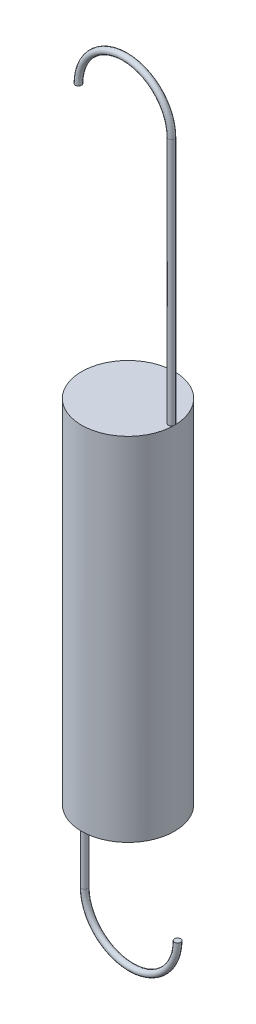
ISO-10303-21;
HEADER;
FILE_DESCRIPTION(('STEP AP214'),'2;1');
FILE_NAME('part.step','',(''),(''),'','','');
FILE_SCHEMA(('AUTOMOTIVE_DESIGN { 1 0 10303 214 1 1 1 1 }'));
ENDSEC;
DATA;
#1=APPLICATION_CONTEXT('core data for automotive mechanical design processes');
#2=APPLICATION_PROTOCOL_DEFINITION('international standard','automotive_design',2000,#1);
#3=PRODUCT_CONTEXT('',#1,'mechanical');
#4=PRODUCT('Part','Part','',(#3));
#5=PRODUCT_RELATED_PRODUCT_CATEGORY('part','',(#4));
#6=PRODUCT_DEFINITION_FORMATION('','',#4);
#7=PRODUCT_DEFINITION_CONTEXT('part definition',#1,'design');
#8=PRODUCT_DEFINITION('design','',#6,#7);
#9=PRODUCT_DEFINITION_SHAPE('','',#8);
#10=(LENGTH_UNIT() NAMED_UNIT(*) SI_UNIT(.MILLI.,.METRE.));
#11=(NAMED_UNIT(*) PLANE_ANGLE_UNIT() SI_UNIT($,.RADIAN.));
#12=(NAMED_UNIT(*) SI_UNIT($,.STERADIAN.) SOLID_ANGLE_UNIT());
#13=UNCERTAINTY_MEASURE_WITH_UNIT(LENGTH_MEASURE(1.E-05),#10,'distance_accuracy_value','');
#14=(GEOMETRIC_REPRESENTATION_CONTEXT(3) GLOBAL_UNCERTAINTY_ASSIGNED_CONTEXT((#13)) GLOBAL_UNIT_ASSIGNED_CONTEXT((#10,
#11,#12)) REPRESENTATION_CONTEXT('',''));
#15=CARTESIAN_POINT('',(0.,0.,0.));
#16=DIRECTION('',(0.,0.,1.));
#17=DIRECTION('',(1.,0.,0.));
#18=AXIS2_PLACEMENT_3D('',#15,#16,#17);
#19=CARTESIAN_POINT('',(0.,22.7,0.));
#20=DIRECTION('',(0.,-1.,0.));
#21=DIRECTION('',(0.,0.,-1.));
#22=AXIS2_PLACEMENT_3D('',#19,#20,#21);
#23=CYLINDRICAL_SURFACE('',#22,3.);
#24=CARTESIAN_POINT('',(0.,22.7,0.));
#25=DIRECTION('',(0.,1.,0.));
#26=DIRECTION('',(0.,0.,1.));
#27=AXIS2_PLACEMENT_3D('',#24,#25,#26);
#28=CIRCLE('',#27,3.);
#29=CARTESIAN_POINT('',(3.,22.7,0.));
#30=VERTEX_POINT('',#29);
#31=EDGE_CURVE('E11',#30,#30,#28,.T.);
#32=ORIENTED_EDGE('',*,*,#31,.F.);
#33=EDGE_LOOP('',(#32));
#34=FACE_BOUND('',#33,.T.);
#35=CARTESIAN_POINT('',(0.,0.,0.));
#36=DIRECTION('',(0.,1.,0.));
#37=DIRECTION('',(0.,0.,1.));
#38=AXIS2_PLACEMENT_3D('',#35,#36,#37);
#39=CIRCLE('',#38,3.);
#40=CARTESIAN_POINT('',(-3.,0.,0.));
#41=VERTEX_POINT('',#40);
#42=EDGE_CURVE('E42',#41,#41,#39,.T.);
#43=ORIENTED_EDGE('',*,*,#42,.T.);
#44=EDGE_LOOP('',(#43));
#45=FACE_BOUND('',#44,.T.);
#46=ADVANCED_FACE('F39',(#34,#45),#23,.T.);
#47=CARTESIAN_POINT('',(0.,22.7,0.));
#48=DIRECTION('',(0.,1.,0.));
#49=DIRECTION('',(0.,0.,1.));
#50=AXIS2_PLACEMENT_3D('',#47,#48,#49);
#51=PLANE('',#50);
#52=ORIENTED_EDGE('',*,*,#31,.T.);
#53=CARTESIAN_POINT('',(2.8,22.7,0.));
#54=DIRECTION('',(0.,1.,0.));
#55=DIRECTION('',(0.,0.,1.));
#56=AXIS2_PLACEMENT_3D('',#53,#54,#55);
#57=CIRCLE('',#56,0.2);
#58=EDGE_CURVE('E65',#30,#30,#57,.T.);
#59=ORIENTED_EDGE('',*,*,#58,.F.);
#60=EDGE_LOOP('',(#52,#59));
#61=FACE_BOUND('',#60,.T.);
#62=ADVANCED_FACE('F95',(#61),#51,.T.);
#63=CARTESIAN_POINT('',(0.,0.,0.));
#64=DIRECTION('',(0.,1.,0.));
#65=DIRECTION('',(0.,0.,1.));
#66=AXIS2_PLACEMENT_3D('',#63,#64,#65);
#67=PLANE('',#66);
#68=ORIENTED_EDGE('',*,*,#42,.F.);
#69=CARTESIAN_POINT('',(-2.8,0.,0.));
#70=DIRECTION('',(0.,-1.,0.));
#71=DIRECTION('',(0.,0.,-1.));
#72=AXIS2_PLACEMENT_3D('',#69,#70,#71);
#73=CIRCLE('',#72,0.2);
#74=EDGE_CURVE('E56',#41,#41,#73,.T.);
#75=ORIENTED_EDGE('',*,*,#74,.F.);
#76=EDGE_LOOP('',(#68,#75));
#77=FACE_BOUND('',#76,.T.);
#78=ADVANCED_FACE('F54',(#77),#67,.F.);
#79=CARTESIAN_POINT('',(-3.2,38.7,0.));
#80=DIRECTION('',(0.,-1.,0.));
#81=DIRECTION('',(0.,0.,1.));
#82=AXIS2_PLACEMENT_3D('',#79,#80,#81);
#83=PLANE('',#82);
#84=CARTESIAN_POINT('',(-3.2,38.7,0.));
#85=DIRECTION('',(0.,-1.,0.));
#86=DIRECTION('',(0.,0.,1.));
#87=AXIS2_PLACEMENT_3D('',#84,#85,#86);
#88=CIRCLE('',#87,0.2);
#89=CARTESIAN_POINT('',(-3.4,38.7,0.));
#90=VERTEX_POINT('',#89);
#91=EDGE_CURVE('E58',#90,#90,#88,.T.);
#92=ORIENTED_EDGE('',*,*,#91,.T.);
#93=EDGE_LOOP('',(#92));
#94=FACE_BOUND('',#93,.T.);
#95=ADVANCED_FACE('F89',(#94),#83,.T.);
#96=CARTESIAN_POINT('',(2.8,22.7,0.));
#97=DIRECTION('',(0.,1.,0.));
#98=DIRECTION('',(0.,0.,1.));
#99=AXIS2_PLACEMENT_3D('',#96,#97,#98);
#100=CYLINDRICAL_SURFACE('',#99,0.2);
#101=CARTESIAN_POINT('',(2.8,38.7,0.));
#102=DIRECTION('',(0.,1.,0.));
#103=DIRECTION('',(0.,0.,1.));
#104=AXIS2_PLACEMENT_3D('',#101,#102,#103);
#105=CIRCLE('',#104,0.2);
#106=CARTESIAN_POINT('',(3.,38.7,0.));
#107=VERTEX_POINT('',#106);
#108=EDGE_CURVE('E60',#107,#107,#105,.T.);
#109=ORIENTED_EDGE('',*,*,#108,.F.);
#110=EDGE_LOOP('',(#109));
#111=FACE_BOUND('',#110,.T.);
#112=ORIENTED_EDGE('',*,*,#58,.T.);
#113=EDGE_LOOP('',(#112));
#114=FACE_BOUND('',#113,.T.);
#115=ADVANCED_FACE('F107',(#111,#114),#100,.T.);
#116=CARTESIAN_POINT('',(-0.2,38.7,0.));
#117=DIRECTION('',(0.,0.,1.));
#118=DIRECTION('',(1.,0.,0.));
#119=AXIS2_PLACEMENT_3D('',#116,#117,#118);
#120=TOROIDAL_SURFACE('',#119,3.,0.2);
#121=CARTESIAN_POINT('',(-0.2,38.7,0.));
#122=DIRECTION('',(0.,0.,1.));
#123=DIRECTION('',(1.,0.,0.));
#124=AXIS2_PLACEMENT_3D('',#121,#122,#123);
#125=CIRCLE('',#124,3.2);
#126=EDGE_CURVE('',#107,#90,#125,.T.);
#127=ORIENTED_EDGE('',*,*,#108,.T.);
#128=ORIENTED_EDGE('',*,*,#91,.F.);
#129=ORIENTED_EDGE('',*,*,#126,.T.);
#130=ORIENTED_EDGE('',*,*,#126,.F.);
#131=EDGE_LOOP('',(#127,#129,#128,#130));
#132=FACE_BOUND('',#131,.T.);
#133=ADVANCED_FACE('F90',(#132),#120,.T.);
#134=CARTESIAN_POINT('',(3.2,-6.,0.));
#135=DIRECTION('',(0.,1.,0.));
#136=DIRECTION('',(0.,0.,-1.));
#137=AXIS2_PLACEMENT_3D('',#134,#135,#136);
#138=PLANE('',#137);
#139=CARTESIAN_POINT('',(3.2,-6.,0.));
#140=DIRECTION('',(0.,1.,0.));
#141=DIRECTION('',(0.,0.,-1.));
#142=AXIS2_PLACEMENT_3D('',#139,#140,#141);
#143=CIRCLE('',#142,0.2);
#144=CARTESIAN_POINT('',(3.4,-6.,0.));
#145=VERTEX_POINT('',#144);
#146=EDGE_CURVE('E70',#145,#145,#143,.T.);
#147=ORIENTED_EDGE('',*,*,#146,.T.);
#148=EDGE_LOOP('',(#147));
#149=FACE_BOUND('',#148,.T.);
#150=ADVANCED_FACE('F80',(#149),#138,.T.);
#151=CARTESIAN_POINT('',(-2.8,0.,0.));
#152=DIRECTION('',(0.,-1.,0.));
#153=DIRECTION('',(1.,0.,0.));
#154=AXIS2_PLACEMENT_3D('',#151,#152,#153);
#155=CYLINDRICAL_SURFACE('',#154,0.2);
#156=CARTESIAN_POINT('',(-2.8,-6.,0.));
#157=DIRECTION('',(0.,-1.,0.));
#158=DIRECTION('',(0.,0.,-1.));
#159=AXIS2_PLACEMENT_3D('',#156,#157,#158);
#160=CIRCLE('',#159,0.2);
#161=CARTESIAN_POINT('',(-3.,-6.,0.));
#162=VERTEX_POINT('',#161);
#163=EDGE_CURVE('E73',#162,#162,#160,.T.);
#164=ORIENTED_EDGE('',*,*,#163,.F.);
#165=EDGE_LOOP('',(#164));
#166=FACE_BOUND('',#165,.T.);
#167=ORIENTED_EDGE('',*,*,#74,.T.);
#168=EDGE_LOOP('',(#167));
#169=FACE_BOUND('',#168,.T.);
#170=ADVANCED_FACE('F77',(#166,#169),#155,.T.);
#171=CARTESIAN_POINT('',(0.200000000000001,-6.,0.));
#172=DIRECTION('',(0.,0.,1.));
#173=DIRECTION('',(1.,0.,0.));
#174=AXIS2_PLACEMENT_3D('',#171,#172,#173);
#175=TOROIDAL_SURFACE('',#174,3.,0.2);
#176=CARTESIAN_POINT('',(0.200000000000001,-6.,0.));
#177=DIRECTION('',(0.,0.,1.));
#178=DIRECTION('',(1.,0.,0.));
#179=AXIS2_PLACEMENT_3D('',#176,#177,#178);
#180=CIRCLE('',#179,3.2);
#181=EDGE_CURVE('',#162,#145,#180,.T.);
#182=ORIENTED_EDGE('',*,*,#163,.T.);
#183=ORIENTED_EDGE('',*,*,#146,.F.);
#184=ORIENTED_EDGE('',*,*,#181,.T.);
#185=ORIENTED_EDGE('',*,*,#181,.F.);
#186=EDGE_LOOP('',(#182,#184,#183,#185));
#187=FACE_BOUND('',#186,.T.);
#188=ADVANCED_FACE('F79',(#187),#175,.T.);
#189=CLOSED_SHELL('',(#46,#62,#78,#95,#115,#133,#150,#170,#188));
#190=MANIFOLD_SOLID_BREP('B2',#189);
#191=ADVANCED_BREP_SHAPE_REPRESENTATION('',(#18,#190),#14);
#192=SHAPE_DEFINITION_REPRESENTATION(#9,#191);
ENDSEC;
END-ISO-10303-21;
